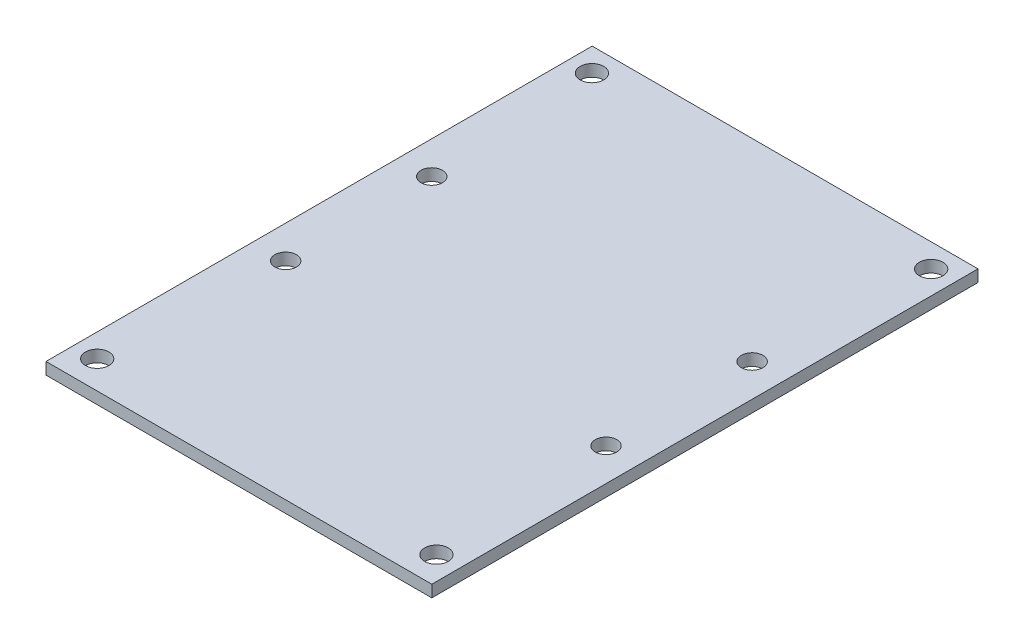
ISO-10303-21;
HEADER;
FILE_DESCRIPTION(('STEP AP214'),'2;1');
FILE_NAME('part.step','',(''),(''),'','','');
FILE_SCHEMA(('AUTOMOTIVE_DESIGN { 1 0 10303 214 1 1 1 1 }'));
ENDSEC;
DATA;
#1=APPLICATION_CONTEXT('core data for automotive mechanical design processes');
#2=APPLICATION_PROTOCOL_DEFINITION('international standard','automotive_design',2000,#1);
#3=PRODUCT_CONTEXT('',#1,'mechanical');
#4=PRODUCT('Part','Part','',(#3));
#5=PRODUCT_RELATED_PRODUCT_CATEGORY('part','',(#4));
#6=PRODUCT_DEFINITION_FORMATION('','',#4);
#7=PRODUCT_DEFINITION_CONTEXT('part definition',#1,'design');
#8=PRODUCT_DEFINITION('design','',#6,#7);
#9=PRODUCT_DEFINITION_SHAPE('','',#8);
#10=(LENGTH_UNIT() NAMED_UNIT(*) SI_UNIT(.MILLI.,.METRE.));
#11=(NAMED_UNIT(*) PLANE_ANGLE_UNIT() SI_UNIT($,.RADIAN.));
#12=(NAMED_UNIT(*) SI_UNIT($,.STERADIAN.) SOLID_ANGLE_UNIT());
#13=UNCERTAINTY_MEASURE_WITH_UNIT(LENGTH_MEASURE(1.E-05),#10,'distance_accuracy_value','');
#14=(GEOMETRIC_REPRESENTATION_CONTEXT(3) GLOBAL_UNCERTAINTY_ASSIGNED_CONTEXT((#13)) GLOBAL_UNIT_ASSIGNED_CONTEXT((#10,
#11,#12)) REPRESENTATION_CONTEXT('',''));
#15=CARTESIAN_POINT('',(0.,0.,0.));
#16=DIRECTION('',(0.,0.,1.));
#17=DIRECTION('',(1.,0.,0.));
#18=AXIS2_PLACEMENT_3D('',#15,#16,#17);
#19=CARTESIAN_POINT('',(25.99817,0.,-36.80587));
#20=DIRECTION('',(-1.,0.,0.));
#21=DIRECTION('',(0.,0.,1.));
#22=AXIS2_PLACEMENT_3D('',#19,#20,#21);
#23=PLANE('',#22);
#24=DIRECTION('',(0.,1.,0.));
#25=VECTOR('',#24,1.);
#26=CARTESIAN_POINT('',(25.99817,0.8,-36.80587));
#27=LINE('',#26,#25);
#28=CARTESIAN_POINT('',(25.99817,0.,-36.80587));
#29=VERTEX_POINT('',#28);
#30=CARTESIAN_POINT('',(25.99817,1.6,-36.80587));
#31=VERTEX_POINT('',#30);
#32=EDGE_CURVE('E67',#29,#31,#27,.T.);
#33=ORIENTED_EDGE('',*,*,#32,.T.);
#34=DIRECTION('',(0.,0.,1.));
#35=VECTOR('',#34,1.);
#36=CARTESIAN_POINT('',(25.99817,1.6,0.));
#37=LINE('',#36,#35);
#38=CARTESIAN_POINT('',(25.99817,1.6,36.80587));
#39=VERTEX_POINT('',#38);
#40=EDGE_CURVE('E130',#31,#39,#37,.T.);
#41=ORIENTED_EDGE('',*,*,#40,.T.);
#42=DIRECTION('',(0.,-1.,0.));
#43=VECTOR('',#42,1.);
#44=CARTESIAN_POINT('',(25.99817,0.8,36.80587));
#45=LINE('',#44,#43);
#46=CARTESIAN_POINT('',(25.99817,0.,36.80587));
#47=VERTEX_POINT('',#46);
#48=EDGE_CURVE('E57',#39,#47,#45,.T.);
#49=ORIENTED_EDGE('',*,*,#48,.T.);
#50=DIRECTION('',(0.,0.,1.));
#51=VECTOR('',#50,1.);
#52=CARTESIAN_POINT('',(25.99817,0.,0.));
#53=LINE('',#52,#51);
#54=EDGE_CURVE('E113',#29,#47,#53,.T.);
#55=ORIENTED_EDGE('',*,*,#54,.F.);
#56=EDGE_LOOP('',(#33,#41,#49,#55));
#57=FACE_BOUND('',#56,.T.);
#58=ADVANCED_FACE('F17',(#57),#23,.F.);
#59=CARTESIAN_POINT('',(25.99817,0.,36.80587));
#60=DIRECTION('',(0.,0.,-1.));
#61=DIRECTION('',(-1.,0.,0.));
#62=AXIS2_PLACEMENT_3D('',#59,#60,#61);
#63=PLANE('',#62);
#64=ORIENTED_EDGE('',*,*,#48,.F.);
#65=DIRECTION('',(-1.,0.,0.));
#66=VECTOR('',#65,1.);
#67=CARTESIAN_POINT('',(0.,1.6,36.80587));
#68=LINE('',#67,#66);
#69=CARTESIAN_POINT('',(-25.99817,1.6,36.80587));
#70=VERTEX_POINT('',#69);
#71=EDGE_CURVE('E73',#39,#70,#68,.T.);
#72=ORIENTED_EDGE('',*,*,#71,.T.);
#73=DIRECTION('',(0.,-1.,0.));
#74=VECTOR('',#73,1.);
#75=CARTESIAN_POINT('',(-25.99817,0.8,36.80587));
#76=LINE('',#75,#74);
#77=CARTESIAN_POINT('',(-25.99817,0.,36.80587));
#78=VERTEX_POINT('',#77);
#79=EDGE_CURVE('E63',#70,#78,#76,.T.);
#80=ORIENTED_EDGE('',*,*,#79,.T.);
#81=DIRECTION('',(-1.,0.,0.));
#82=VECTOR('',#81,1.);
#83=CARTESIAN_POINT('',(0.,0.,36.80587));
#84=LINE('',#83,#82);
#85=EDGE_CURVE('E137',#47,#78,#84,.T.);
#86=ORIENTED_EDGE('',*,*,#85,.F.);
#87=EDGE_LOOP('',(#64,#72,#80,#86));
#88=FACE_BOUND('',#87,.T.);
#89=ADVANCED_FACE('F78',(#88),#63,.F.);
#90=CARTESIAN_POINT('',(-25.99817,0.,36.80587));
#91=DIRECTION('',(1.,0.,0.));
#92=DIRECTION('',(0.,0.,-1.));
#93=AXIS2_PLACEMENT_3D('',#90,#91,#92);
#94=PLANE('',#93);
#95=ORIENTED_EDGE('',*,*,#79,.F.);
#96=DIRECTION('',(0.,0.,-1.));
#97=VECTOR('',#96,1.);
#98=CARTESIAN_POINT('',(-25.99817,1.6,0.));
#99=LINE('',#98,#97);
#100=CARTESIAN_POINT('',(-25.99817,1.6,-36.80587));
#101=VERTEX_POINT('',#100);
#102=EDGE_CURVE('E66',#70,#101,#99,.T.);
#103=ORIENTED_EDGE('',*,*,#102,.T.);
#104=DIRECTION('',(0.,-1.,0.));
#105=VECTOR('',#104,1.);
#106=CARTESIAN_POINT('',(-25.99817,0.8,-36.80587));
#107=LINE('',#106,#105);
#108=CARTESIAN_POINT('',(-25.99817,0.,-36.80587));
#109=VERTEX_POINT('',#108);
#110=EDGE_CURVE('E79',#101,#109,#107,.T.);
#111=ORIENTED_EDGE('',*,*,#110,.T.);
#112=DIRECTION('',(0.,0.,-1.));
#113=VECTOR('',#112,1.);
#114=CARTESIAN_POINT('',(-25.99817,0.,0.));
#115=LINE('',#114,#113);
#116=EDGE_CURVE('E36',#78,#109,#115,.T.);
#117=ORIENTED_EDGE('',*,*,#116,.F.);
#118=EDGE_LOOP('',(#95,#103,#111,#117));
#119=FACE_BOUND('',#118,.T.);
#120=ADVANCED_FACE('F65',(#119),#94,.F.);
#121=CARTESIAN_POINT('',(-25.99817,0.,-36.80587));
#122=DIRECTION('',(0.,0.,1.));
#123=DIRECTION('',(1.,0.,0.));
#124=AXIS2_PLACEMENT_3D('',#121,#122,#123);
#125=PLANE('',#124);
#126=ORIENTED_EDGE('',*,*,#110,.F.);
#127=DIRECTION('',(1.,0.,0.));
#128=VECTOR('',#127,1.);
#129=CARTESIAN_POINT('',(0.,1.6,-36.80587));
#130=LINE('',#129,#128);
#131=EDGE_CURVE('E76',#101,#31,#130,.T.);
#132=ORIENTED_EDGE('',*,*,#131,.T.);
#133=ORIENTED_EDGE('',*,*,#32,.F.);
#134=DIRECTION('',(1.,0.,0.));
#135=VECTOR('',#134,1.);
#136=CARTESIAN_POINT('',(0.,0.,-36.80587));
#137=LINE('',#136,#135);
#138=EDGE_CURVE('E109',#109,#29,#137,.T.);
#139=ORIENTED_EDGE('',*,*,#138,.F.);
#140=EDGE_LOOP('',(#126,#132,#133,#139));
#141=FACE_BOUND('',#140,.T.);
#142=ADVANCED_FACE('F143',(#141),#125,.F.);
#143=CARTESIAN_POINT('',(21.59,1.6,-10.77087));
#144=DIRECTION('',(0.,-1.,0.));
#145=DIRECTION('',(0.,0.,-1.));
#146=AXIS2_PLACEMENT_3D('',#143,#144,#145);
#147=CYLINDRICAL_SURFACE('',#146,1.45);
#148=CARTESIAN_POINT('',(21.59,1.6,-10.77087));
#149=DIRECTION('',(0.,-1.,0.));
#150=DIRECTION('',(0.,0.,-1.));
#151=AXIS2_PLACEMENT_3D('',#148,#149,#150);
#152=CIRCLE('',#151,1.45);
#153=CARTESIAN_POINT('',(21.59,1.6,-12.22087));
#154=VERTEX_POINT('',#153);
#155=EDGE_CURVE('E21',#154,#154,#152,.F.);
#156=ORIENTED_EDGE('',*,*,#155,.T.);
#157=EDGE_LOOP('',(#156));
#158=FACE_BOUND('',#157,.T.);
#159=CARTESIAN_POINT('',(21.59,0.,-10.77087));
#160=DIRECTION('',(0.,-1.,0.));
#161=DIRECTION('',(0.,0.,-1.));
#162=AXIS2_PLACEMENT_3D('',#159,#160,#161);
#163=CIRCLE('',#162,1.45);
#164=CARTESIAN_POINT('',(21.59,0.,-12.22087));
#165=VERTEX_POINT('',#164);
#166=EDGE_CURVE('E106',#165,#165,#163,.F.);
#167=ORIENTED_EDGE('',*,*,#166,.F.);
#168=EDGE_LOOP('',(#167));
#169=FACE_BOUND('',#168,.T.);
#170=ADVANCED_FACE('F145',(#158,#169),#147,.F.);
#171=CARTESIAN_POINT('',(-21.59,1.6,-10.77087));
#172=DIRECTION('',(0.,-1.,0.));
#173=DIRECTION('',(0.,0.,-1.));
#174=AXIS2_PLACEMENT_3D('',#171,#172,#173);
#175=CYLINDRICAL_SURFACE('',#174,1.45);
#176=CARTESIAN_POINT('',(-21.59,1.6,-10.77087));
#177=DIRECTION('',(0.,-1.,0.));
#178=DIRECTION('',(0.,0.,-1.));
#179=AXIS2_PLACEMENT_3D('',#176,#177,#178);
#180=CIRCLE('',#179,1.45);
#181=CARTESIAN_POINT('',(-21.59,1.6,-12.22087));
#182=VERTEX_POINT('',#181);
#183=EDGE_CURVE('E125',#182,#182,#180,.F.);
#184=ORIENTED_EDGE('',*,*,#183,.T.);
#185=EDGE_LOOP('',(#184));
#186=FACE_BOUND('',#185,.T.);
#187=CARTESIAN_POINT('',(-21.59,0.,-10.77087));
#188=DIRECTION('',(0.,-1.,0.));
#189=DIRECTION('',(0.,0.,-1.));
#190=AXIS2_PLACEMENT_3D('',#187,#188,#189);
#191=CIRCLE('',#190,1.45);
#192=CARTESIAN_POINT('',(-21.59,0.,-12.22087));
#193=VERTEX_POINT('',#192);
#194=EDGE_CURVE('E103',#193,#193,#191,.F.);
#195=ORIENTED_EDGE('',*,*,#194,.F.);
#196=EDGE_LOOP('',(#195));
#197=FACE_BOUND('',#196,.T.);
#198=ADVANCED_FACE('F152',(#186,#197),#175,.F.);
#199=CARTESIAN_POINT('',(22.86,1.6,-33.63087));
#200=DIRECTION('',(0.,-1.,0.));
#201=DIRECTION('',(0.,0.,-1.));
#202=AXIS2_PLACEMENT_3D('',#199,#200,#201);
#203=CYLINDRICAL_SURFACE('',#202,1.58750000000001);
#204=CARTESIAN_POINT('',(22.86,1.6,-33.63087));
#205=DIRECTION('',(0.,-1.,0.));
#206=DIRECTION('',(0.,0.,-1.));
#207=AXIS2_PLACEMENT_3D('',#204,#205,#206);
#208=CIRCLE('',#207,1.58750000000001);
#209=CARTESIAN_POINT('',(22.86,1.6,-35.21837));
#210=VERTEX_POINT('',#209);
#211=EDGE_CURVE('E123',#210,#210,#208,.F.);
#212=ORIENTED_EDGE('',*,*,#211,.T.);
#213=EDGE_LOOP('',(#212));
#214=FACE_BOUND('',#213,.T.);
#215=CARTESIAN_POINT('',(22.86,0.,-33.63087));
#216=DIRECTION('',(0.,-1.,0.));
#217=DIRECTION('',(0.,0.,-1.));
#218=AXIS2_PLACEMENT_3D('',#215,#216,#217);
#219=CIRCLE('',#218,1.58750000000001);
#220=CARTESIAN_POINT('',(22.86,0.,-35.21837));
#221=VERTEX_POINT('',#220);
#222=EDGE_CURVE('E100',#221,#221,#219,.F.);
#223=ORIENTED_EDGE('',*,*,#222,.F.);
#224=EDGE_LOOP('',(#223));
#225=FACE_BOUND('',#224,.T.);
#226=ADVANCED_FACE('F180',(#214,#225),#203,.F.);
#227=CARTESIAN_POINT('',(-22.86,1.6,33.04413));
#228=DIRECTION('',(0.,-1.,0.));
#229=DIRECTION('',(0.,0.,-1.));
#230=AXIS2_PLACEMENT_3D('',#227,#228,#229);
#231=CYLINDRICAL_SURFACE('',#230,1.58750000000001);
#232=CARTESIAN_POINT('',(-22.86,1.6,33.04413));
#233=DIRECTION('',(0.,-1.,0.));
#234=DIRECTION('',(0.,0.,-1.));
#235=AXIS2_PLACEMENT_3D('',#232,#233,#234);
#236=CIRCLE('',#235,1.58750000000001);
#237=CARTESIAN_POINT('',(-22.86,1.6,31.45663));
#238=VERTEX_POINT('',#237);
#239=EDGE_CURVE('E120',#238,#238,#236,.F.);
#240=ORIENTED_EDGE('',*,*,#239,.T.);
#241=EDGE_LOOP('',(#240));
#242=FACE_BOUND('',#241,.T.);
#243=CARTESIAN_POINT('',(-22.86,0.,33.04413));
#244=DIRECTION('',(0.,-1.,0.));
#245=DIRECTION('',(0.,0.,-1.));
#246=AXIS2_PLACEMENT_3D('',#243,#244,#245);
#247=CIRCLE('',#246,1.58750000000001);
#248=CARTESIAN_POINT('',(-22.86,0.,31.45663));
#249=VERTEX_POINT('',#248);
#250=EDGE_CURVE('E97',#249,#249,#247,.F.);
#251=ORIENTED_EDGE('',*,*,#250,.F.);
#252=EDGE_LOOP('',(#251));
#253=FACE_BOUND('',#252,.T.);
#254=ADVANCED_FACE('F176',(#242,#253),#231,.F.);
#255=CARTESIAN_POINT('',(22.86,1.6,33.04413));
#256=DIRECTION('',(0.,-1.,0.));
#257=DIRECTION('',(0.,0.,-1.));
#258=AXIS2_PLACEMENT_3D('',#255,#256,#257);
#259=CYLINDRICAL_SURFACE('',#258,1.58750000000001);
#260=CARTESIAN_POINT('',(22.86,1.6,33.04413));
#261=DIRECTION('',(0.,-1.,0.));
#262=DIRECTION('',(0.,0.,-1.));
#263=AXIS2_PLACEMENT_3D('',#260,#261,#262);
#264=CIRCLE('',#263,1.58750000000001);
#265=CARTESIAN_POINT('',(22.86,1.6,31.45663));
#266=VERTEX_POINT('',#265);
#267=EDGE_CURVE('E117',#266,#266,#264,.F.);
#268=ORIENTED_EDGE('',*,*,#267,.T.);
#269=EDGE_LOOP('',(#268));
#270=FACE_BOUND('',#269,.T.);
#271=CARTESIAN_POINT('',(22.86,0.,33.04413));
#272=DIRECTION('',(0.,-1.,0.));
#273=DIRECTION('',(0.,0.,-1.));
#274=AXIS2_PLACEMENT_3D('',#271,#272,#273);
#275=CIRCLE('',#274,1.58750000000001);
#276=CARTESIAN_POINT('',(22.86,0.,31.45663));
#277=VERTEX_POINT('',#276);
#278=EDGE_CURVE('E94',#277,#277,#275,.F.);
#279=ORIENTED_EDGE('',*,*,#278,.F.);
#280=EDGE_LOOP('',(#279));
#281=FACE_BOUND('',#280,.T.);
#282=ADVANCED_FACE('F172',(#270,#281),#259,.F.);
#283=CARTESIAN_POINT('',(-22.86,1.6,-33.63087));
#284=DIRECTION('',(0.,-1.,0.));
#285=DIRECTION('',(0.,0.,-1.));
#286=AXIS2_PLACEMENT_3D('',#283,#284,#285);
#287=CYLINDRICAL_SURFACE('',#286,1.58750000000001);
#288=CARTESIAN_POINT('',(-22.86,1.6,-33.63087));
#289=DIRECTION('',(0.,-1.,0.));
#290=DIRECTION('',(0.,0.,-1.));
#291=AXIS2_PLACEMENT_3D('',#288,#289,#290);
#292=CIRCLE('',#291,1.58750000000001);
#293=CARTESIAN_POINT('',(-22.86,1.6,-35.21837));
#294=VERTEX_POINT('',#293);
#295=EDGE_CURVE('E114',#294,#294,#292,.F.);
#296=ORIENTED_EDGE('',*,*,#295,.T.);
#297=EDGE_LOOP('',(#296));
#298=FACE_BOUND('',#297,.T.);
#299=CARTESIAN_POINT('',(-22.86,0.,-33.63087));
#300=DIRECTION('',(0.,-1.,0.));
#301=DIRECTION('',(0.,0.,-1.));
#302=AXIS2_PLACEMENT_3D('',#299,#300,#301);
#303=CIRCLE('',#302,1.58750000000001);
#304=CARTESIAN_POINT('',(-22.86,0.,-35.21837));
#305=VERTEX_POINT('',#304);
#306=EDGE_CURVE('E91',#305,#305,#303,.F.);
#307=ORIENTED_EDGE('',*,*,#306,.F.);
#308=EDGE_LOOP('',(#307));
#309=FACE_BOUND('',#308,.T.);
#310=ADVANCED_FACE('F168',(#298,#309),#287,.F.);
#311=CARTESIAN_POINT('',(-21.59,1.6,8.91413));
#312=DIRECTION('',(0.,-1.,0.));
#313=DIRECTION('',(0.,0.,-1.));
#314=AXIS2_PLACEMENT_3D('',#311,#312,#313);
#315=CYLINDRICAL_SURFACE('',#314,1.45);
#316=CARTESIAN_POINT('',(-21.59,1.6,8.91413));
#317=DIRECTION('',(0.,-1.,0.));
#318=DIRECTION('',(0.,0.,-1.));
#319=AXIS2_PLACEMENT_3D('',#316,#317,#318);
#320=CIRCLE('',#319,1.45);
#321=CARTESIAN_POINT('',(-21.59,1.6,7.46413));
#322=VERTEX_POINT('',#321);
#323=EDGE_CURVE('E110',#322,#322,#320,.F.);
#324=ORIENTED_EDGE('',*,*,#323,.T.);
#325=EDGE_LOOP('',(#324));
#326=FACE_BOUND('',#325,.T.);
#327=CARTESIAN_POINT('',(-21.59,0.,8.91413));
#328=DIRECTION('',(0.,-1.,0.));
#329=DIRECTION('',(0.,0.,-1.));
#330=AXIS2_PLACEMENT_3D('',#327,#328,#329);
#331=CIRCLE('',#330,1.45);
#332=CARTESIAN_POINT('',(-21.59,0.,7.46413));
#333=VERTEX_POINT('',#332);
#334=EDGE_CURVE('E88',#333,#333,#331,.F.);
#335=ORIENTED_EDGE('',*,*,#334,.F.);
#336=EDGE_LOOP('',(#335));
#337=FACE_BOUND('',#336,.T.);
#338=ADVANCED_FACE('F165',(#326,#337),#315,.F.);
#339=CARTESIAN_POINT('',(-25.99817,1.6,36.80587));
#340=DIRECTION('',(0.,-1.,0.));
#341=DIRECTION('',(0.,0.,-1.));
#342=AXIS2_PLACEMENT_3D('',#339,#340,#341);
#343=PLANE('',#342);
#344=CARTESIAN_POINT('',(21.59,1.6,8.91413));
#345=DIRECTION('',(0.,-1.,0.));
#346=DIRECTION('',(0.,0.,-1.));
#347=AXIS2_PLACEMENT_3D('',#344,#345,#346);
#348=CIRCLE('',#347,1.45);
#349=CARTESIAN_POINT('',(21.59,1.6,7.46413));
#350=VERTEX_POINT('',#349);
#351=EDGE_CURVE('E27',#350,#350,#348,.F.);
#352=ORIENTED_EDGE('',*,*,#351,.F.);
#353=EDGE_LOOP('',(#352));
#354=FACE_BOUND('',#353,.T.);
#355=ORIENTED_EDGE('',*,*,#323,.F.);
#356=EDGE_LOOP('',(#355));
#357=FACE_BOUND('',#356,.T.);
#358=ORIENTED_EDGE('',*,*,#295,.F.);
#359=EDGE_LOOP('',(#358));
#360=FACE_BOUND('',#359,.T.);
#361=ORIENTED_EDGE('',*,*,#267,.F.);
#362=EDGE_LOOP('',(#361));
#363=FACE_BOUND('',#362,.T.);
#364=ORIENTED_EDGE('',*,*,#239,.F.);
#365=EDGE_LOOP('',(#364));
#366=FACE_BOUND('',#365,.T.);
#367=ORIENTED_EDGE('',*,*,#211,.F.);
#368=EDGE_LOOP('',(#367));
#369=FACE_BOUND('',#368,.T.);
#370=ORIENTED_EDGE('',*,*,#183,.F.);
#371=EDGE_LOOP('',(#370));
#372=FACE_BOUND('',#371,.T.);
#373=ORIENTED_EDGE('',*,*,#155,.F.);
#374=EDGE_LOOP('',(#373));
#375=FACE_BOUND('',#374,.T.);
#376=ORIENTED_EDGE('',*,*,#131,.F.);
#377=ORIENTED_EDGE('',*,*,#102,.F.);
#378=ORIENTED_EDGE('',*,*,#71,.F.);
#379=ORIENTED_EDGE('',*,*,#40,.F.);
#380=EDGE_LOOP('',(#376,#377,#378,#379));
#381=FACE_BOUND('',#380,.T.);
#382=ADVANCED_FACE('F71',(#354,#357,#360,#363,#366,#369,#372,#375,#381),#343,.F.);
#383=CARTESIAN_POINT('',(-25.99817,0.,36.80587));
#384=DIRECTION('',(0.,-1.,0.));
#385=DIRECTION('',(0.,0.,-1.));
#386=AXIS2_PLACEMENT_3D('',#383,#384,#385);
#387=PLANE('',#386);
#388=CARTESIAN_POINT('',(21.59,0.,8.91413));
#389=DIRECTION('',(0.,-1.,0.));
#390=DIRECTION('',(0.,0.,-1.));
#391=AXIS2_PLACEMENT_3D('',#388,#389,#390);
#392=CIRCLE('',#391,1.45);
#393=CARTESIAN_POINT('',(21.59,0.,7.46413));
#394=VERTEX_POINT('',#393);
#395=EDGE_CURVE('E11',#394,#394,#392,.T.);
#396=ORIENTED_EDGE('',*,*,#395,.F.);
#397=EDGE_LOOP('',(#396));
#398=FACE_BOUND('',#397,.T.);
#399=ORIENTED_EDGE('',*,*,#334,.T.);
#400=EDGE_LOOP('',(#399));
#401=FACE_BOUND('',#400,.T.);
#402=ORIENTED_EDGE('',*,*,#306,.T.);
#403=EDGE_LOOP('',(#402));
#404=FACE_BOUND('',#403,.T.);
#405=ORIENTED_EDGE('',*,*,#278,.T.);
#406=EDGE_LOOP('',(#405));
#407=FACE_BOUND('',#406,.T.);
#408=ORIENTED_EDGE('',*,*,#250,.T.);
#409=EDGE_LOOP('',(#408));
#410=FACE_BOUND('',#409,.T.);
#411=ORIENTED_EDGE('',*,*,#222,.T.);
#412=EDGE_LOOP('',(#411));
#413=FACE_BOUND('',#412,.T.);
#414=ORIENTED_EDGE('',*,*,#194,.T.);
#415=EDGE_LOOP('',(#414));
#416=FACE_BOUND('',#415,.T.);
#417=ORIENTED_EDGE('',*,*,#166,.T.);
#418=EDGE_LOOP('',(#417));
#419=FACE_BOUND('',#418,.T.);
#420=ORIENTED_EDGE('',*,*,#116,.T.);
#421=ORIENTED_EDGE('',*,*,#138,.T.);
#422=ORIENTED_EDGE('',*,*,#54,.T.);
#423=ORIENTED_EDGE('',*,*,#85,.T.);
#424=EDGE_LOOP('',(#420,#421,#422,#423));
#425=FACE_BOUND('',#424,.T.);
#426=ADVANCED_FACE('F19',(#398,#401,#404,#407,#410,#413,#416,#419,#425),#387,.T.);
#427=CARTESIAN_POINT('',(21.59,1.6,8.91413));
#428=DIRECTION('',(0.,-1.,0.));
#429=DIRECTION('',(0.,0.,-1.));
#430=AXIS2_PLACEMENT_3D('',#427,#428,#429);
#431=CYLINDRICAL_SURFACE('',#430,1.45);
#432=ORIENTED_EDGE('',*,*,#351,.T.);
#433=EDGE_LOOP('',(#432));
#434=FACE_BOUND('',#433,.T.);
#435=ORIENTED_EDGE('',*,*,#395,.T.);
#436=EDGE_LOOP('',(#435));
#437=FACE_BOUND('',#436,.T.);
#438=ADVANCED_FACE('F155',(#434,#437),#431,.F.);
#439=CLOSED_SHELL('',(#58,#89,#120,#142,#170,#198,#226,#254,#282,#310,#338,#382,#426,#438));
#440=MANIFOLD_SOLID_BREP('B1',#439);
#441=ADVANCED_BREP_SHAPE_REPRESENTATION('',(#18,#440),#14);
#442=SHAPE_DEFINITION_REPRESENTATION(#9,#441);
ENDSEC;
END-ISO-10303-21;
